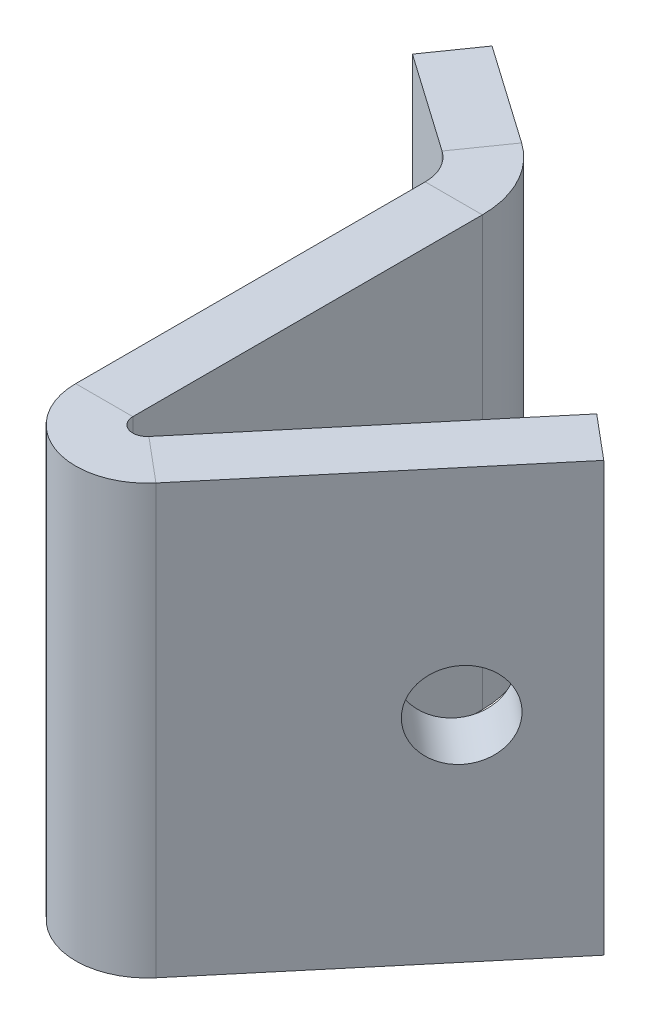
ISO-10303-21;
HEADER;
FILE_DESCRIPTION(('STEP AP214'),'2;1');
FILE_NAME('part.step','',(''),(''),'','','');
FILE_SCHEMA(('AUTOMOTIVE_DESIGN { 1 0 10303 214 1 1 1 1 }'));
ENDSEC;
DATA;
#1=APPLICATION_CONTEXT('core data for automotive mechanical design processes');
#2=APPLICATION_PROTOCOL_DEFINITION('international standard','automotive_design',2000,#1);
#3=PRODUCT_CONTEXT('',#1,'mechanical');
#4=PRODUCT('Part','Part','',(#3));
#5=PRODUCT_RELATED_PRODUCT_CATEGORY('part','',(#4));
#6=PRODUCT_DEFINITION_FORMATION('','',#4);
#7=PRODUCT_DEFINITION_CONTEXT('part definition',#1,'design');
#8=PRODUCT_DEFINITION('design','',#6,#7);
#9=PRODUCT_DEFINITION_SHAPE('','',#8);
#10=(LENGTH_UNIT() NAMED_UNIT(*) SI_UNIT(.MILLI.,.METRE.));
#11=(NAMED_UNIT(*) PLANE_ANGLE_UNIT() SI_UNIT($,.RADIAN.));
#12=(NAMED_UNIT(*) SI_UNIT($,.STERADIAN.) SOLID_ANGLE_UNIT());
#13=UNCERTAINTY_MEASURE_WITH_UNIT(LENGTH_MEASURE(1.E-05),#10,'distance_accuracy_value','');
#14=(GEOMETRIC_REPRESENTATION_CONTEXT(3) GLOBAL_UNCERTAINTY_ASSIGNED_CONTEXT((#13)) GLOBAL_UNIT_ASSIGNED_CONTEXT((#10,
#11,#12)) REPRESENTATION_CONTEXT('',''));
#15=CARTESIAN_POINT('',(0.,0.,0.));
#16=DIRECTION('',(0.,0.,1.));
#17=DIRECTION('',(1.,0.,0.));
#18=AXIS2_PLACEMENT_3D('',#15,#16,#17);
#19=CARTESIAN_POINT('',(2.09668481034567,10.5,-14.6276896660342));
#20=DIRECTION('',(0.,1.,0.));
#21=DIRECTION('',(0.,0.,-1.));
#22=AXIS2_PLACEMENT_3D('',#19,#20,#21);
#23=PLANE('',#22);
#24=DIRECTION('',(0.,0.,1.));
#25=VECTOR('',#24,1.);
#26=CARTESIAN_POINT('',(0.896684810345671,10.5,-14.6276896660342));
#27=LINE('',#26,#25);
#28=CARTESIAN_POINT('',(0.896684810345671,10.5,-17.3188014841031));
#29=VERTEX_POINT('',#28);
#30=CARTESIAN_POINT('',(0.896684810345671,10.5,-24.6591793205376));
#31=VERTEX_POINT('',#30);
#32=EDGE_CURVE('E66',#29,#31,#27,.F.);
#33=ORIENTED_EDGE('',*,*,#32,.T.);
#34=DIRECTION('',(1.,0.,0.));
#35=VECTOR('',#34,1.);
#36=CARTESIAN_POINT('',(0.896684810345669,10.5,-24.6591793205376));
#37=LINE('',#36,#35);
#38=CARTESIAN_POINT('',(2.09668481034567,10.5,-24.6591793205376));
#39=VERTEX_POINT('',#38);
#40=EDGE_CURVE('E208',#31,#39,#37,.T.);
#41=ORIENTED_EDGE('',*,*,#40,.T.);
#42=DIRECTION('',(0.,0.,-1.));
#43=VECTOR('',#42,1.);
#44=CARTESIAN_POINT('',(2.09668481034567,10.5,-14.6276896660342));
#45=LINE('',#44,#43);
#46=CARTESIAN_POINT('',(2.09668481034567,10.5,-17.3188014841031));
#47=VERTEX_POINT('',#46);
#48=EDGE_CURVE('E72',#47,#39,#45,.T.);
#49=ORIENTED_EDGE('',*,*,#48,.F.);
#50=DIRECTION('',(-1.,0.,0.));
#51=VECTOR('',#50,1.);
#52=CARTESIAN_POINT('',(2.09668481034567,10.5,-17.3188014841031));
#53=LINE('',#52,#51);
#54=EDGE_CURVE('E278',#47,#29,#53,.T.);
#55=ORIENTED_EDGE('',*,*,#54,.T.);
#56=EDGE_LOOP('',(#33,#41,#49,#55));
#57=FACE_BOUND('',#56,.T.);
#58=ADVANCED_FACE('F63',(#57),#23,.F.);
#59=CARTESIAN_POINT('',(2.09668481034567,10.5,-14.6276896660342));
#60=DIRECTION('',(-1.,0.,0.));
#61=DIRECTION('',(0.,0.,1.));
#62=AXIS2_PLACEMENT_3D('',#59,#60,#61);
#63=PLANE('',#62);
#64=DIRECTION('',(0.,-1.,0.));
#65=VECTOR('',#64,1.);
#66=CARTESIAN_POINT('',(2.09668481034567,10.5,-24.6591793205376));
#67=LINE('',#66,#65);
#68=CARTESIAN_POINT('',(2.09668481034567,19.5,-24.6591793205376));
#69=VERTEX_POINT('',#68);
#70=EDGE_CURVE('E199',#39,#69,#67,.F.);
#71=ORIENTED_EDGE('',*,*,#70,.T.);
#72=DIRECTION('',(0.,0.,1.));
#73=VECTOR('',#72,1.);
#74=CARTESIAN_POINT('',(2.09668481034567,19.5,-14.6276896660342));
#75=LINE('',#74,#73);
#76=CARTESIAN_POINT('',(2.09668481034567,19.5,-17.3188014841031));
#77=VERTEX_POINT('',#76);
#78=EDGE_CURVE('E13',#69,#77,#75,.T.);
#79=ORIENTED_EDGE('',*,*,#78,.T.);
#80=DIRECTION('',(0.,-1.,0.));
#81=VECTOR('',#80,1.);
#82=CARTESIAN_POINT('',(2.09668481034567,10.5,-17.3188014841031));
#83=LINE('',#82,#81);
#84=EDGE_CURVE('E286',#47,#77,#83,.F.);
#85=ORIENTED_EDGE('',*,*,#84,.F.);
#86=ORIENTED_EDGE('',*,*,#48,.T.);
#87=EDGE_LOOP('',(#71,#79,#85,#86));
#88=FACE_BOUND('',#87,.T.);
#89=ADVANCED_FACE('F360',(#88),#63,.F.);
#90=CARTESIAN_POINT('',(0.896684810345671,10.5,-14.6276896660342));
#91=DIRECTION('',(-1.,0.,0.));
#92=DIRECTION('',(0.,0.,1.));
#93=AXIS2_PLACEMENT_3D('',#90,#91,#92);
#94=PLANE('',#93);
#95=DIRECTION('',(0.,0.,1.));
#96=VECTOR('',#95,1.);
#97=CARTESIAN_POINT('',(0.896684810345671,19.5,-14.6276896660342));
#98=LINE('',#97,#96);
#99=CARTESIAN_POINT('',(0.896684810345671,19.5,-24.6591793205376));
#100=VERTEX_POINT('',#99);
#101=CARTESIAN_POINT('',(0.896684810345671,19.5,-17.3188014841031));
#102=VERTEX_POINT('',#101);
#103=EDGE_CURVE('E301',#100,#102,#98,.T.);
#104=ORIENTED_EDGE('',*,*,#103,.F.);
#105=DIRECTION('',(0.,-1.,0.));
#106=VECTOR('',#105,1.);
#107=CARTESIAN_POINT('',(0.896684810345669,10.5,-24.6591793205376));
#108=LINE('',#107,#106);
#109=EDGE_CURVE('E80',#31,#100,#108,.F.);
#110=ORIENTED_EDGE('',*,*,#109,.F.);
#111=ORIENTED_EDGE('',*,*,#32,.F.);
#112=DIRECTION('',(0.,-1.,0.));
#113=VECTOR('',#112,1.);
#114=CARTESIAN_POINT('',(0.896684810345671,10.5,-17.3188014841031));
#115=LINE('',#114,#113);
#116=EDGE_CURVE('E269',#29,#102,#115,.F.);
#117=ORIENTED_EDGE('',*,*,#116,.T.);
#118=EDGE_LOOP('',(#104,#110,#111,#117));
#119=FACE_BOUND('',#118,.T.);
#120=ADVANCED_FACE('F364',(#119),#94,.T.);
#121=CARTESIAN_POINT('',(2.09668481034567,19.5,-14.6276896660342));
#122=DIRECTION('',(0.,-1.,0.));
#123=DIRECTION('',(0.,0.,1.));
#124=AXIS2_PLACEMENT_3D('',#121,#122,#123);
#125=PLANE('',#124);
#126=DIRECTION('',(1.,0.,0.));
#127=VECTOR('',#126,1.);
#128=CARTESIAN_POINT('',(0.896684810345668,19.5,-24.6591793205376));
#129=LINE('',#128,#127);
#130=EDGE_CURVE('E88',#100,#69,#129,.T.);
#131=ORIENTED_EDGE('',*,*,#130,.F.);
#132=ORIENTED_EDGE('',*,*,#103,.T.);
#133=DIRECTION('',(-1.,0.,0.));
#134=VECTOR('',#133,1.);
#135=CARTESIAN_POINT('',(2.09668481034567,19.5,-17.3188014841031));
#136=LINE('',#135,#134);
#137=EDGE_CURVE('E293',#77,#102,#136,.T.);
#138=ORIENTED_EDGE('',*,*,#137,.F.);
#139=ORIENTED_EDGE('',*,*,#78,.F.);
#140=EDGE_LOOP('',(#131,#132,#138,#139));
#141=FACE_BOUND('',#140,.T.);
#142=ADVANCED_FACE('F370',(#141),#125,.F.);
#143=CARTESIAN_POINT('',(2.39668481034567,19.5,-17.3188014841031));
#144=DIRECTION('',(0.,1.,0.));
#145=DIRECTION('',(-1.,0.,0.));
#146=AXIS2_PLACEMENT_3D('',#143,#144,#145);
#147=PLANE('',#146);
#148=DIRECTION('',(-0.766044443118977,0.,-0.64278760968654));
#149=VECTOR('',#148,1.);
#150=CARTESIAN_POINT('',(3.54575147502413,19.5,-16.3546200695733));
#151=LINE('',#150,#149);
#152=CARTESIAN_POINT('',(2.62649814328136,19.5,-17.1259652011971));
#153=VERTEX_POINT('',#152);
#154=CARTESIAN_POINT('',(3.54575147502413,19.5,-16.3546200695733));
#155=VERTEX_POINT('',#154);
#156=EDGE_CURVE('E223',#153,#155,#151,.F.);
#157=ORIENTED_EDGE('',*,*,#156,.F.);
#158=CARTESIAN_POINT('',(2.39668481034567,19.5,-17.3188014841031));
#159=DIRECTION('',(0.,-1.,0.));
#160=DIRECTION('',(1.,0.,0.));
#161=AXIS2_PLACEMENT_3D('',#158,#159,#160);
#162=CIRCLE('',#161,0.299999999999998);
#163=EDGE_CURVE('E282',#77,#153,#162,.F.);
#164=ORIENTED_EDGE('',*,*,#163,.F.);
#165=ORIENTED_EDGE('',*,*,#137,.T.);
#166=CARTESIAN_POINT('',(2.39668481034567,19.5,-17.3188014841031));
#167=DIRECTION('',(0.,-1.,0.));
#168=DIRECTION('',(1.,0.,0.));
#169=AXIS2_PLACEMENT_3D('',#166,#167,#168);
#170=CIRCLE('',#169,1.5);
#171=EDGE_CURVE('E273',#102,#155,#170,.F.);
#172=ORIENTED_EDGE('',*,*,#171,.T.);
#173=EDGE_LOOP('',(#157,#164,#165,#172));
#174=FACE_BOUND('',#173,.T.);
#175=ADVANCED_FACE('F376',(#174),#147,.T.);
#176=CARTESIAN_POINT('',(2.39668481034567,10.5,-17.3188014841031));
#177=DIRECTION('',(0.,1.,0.));
#178=DIRECTION('',(-1.,0.,0.));
#179=AXIS2_PLACEMENT_3D('',#176,#177,#178);
#180=PLANE('',#179);
#181=CARTESIAN_POINT('',(2.39668481034567,10.5,-17.3188014841031));
#182=DIRECTION('',(0.,-1.,0.));
#183=DIRECTION('',(1.,0.,0.));
#184=AXIS2_PLACEMENT_3D('',#181,#182,#183);
#185=CIRCLE('',#184,0.299999999999998);
#186=CARTESIAN_POINT('',(2.62649814328136,10.5,-17.1259652011971));
#187=VERTEX_POINT('',#186);
#188=EDGE_CURVE('E231',#187,#47,#185,.T.);
#189=ORIENTED_EDGE('',*,*,#188,.F.);
#190=DIRECTION('',(-0.766044443118977,0.,-0.64278760968654));
#191=VECTOR('',#190,1.);
#192=CARTESIAN_POINT('',(2.62649814328136,10.5,-17.1259652011971));
#193=LINE('',#192,#191);
#194=CARTESIAN_POINT('',(3.54575147502413,10.5,-16.3546200695733));
#195=VERTEX_POINT('',#194);
#196=EDGE_CURVE('E259',#187,#195,#193,.F.);
#197=ORIENTED_EDGE('',*,*,#196,.T.);
#198=CARTESIAN_POINT('',(2.39668481034567,10.5,-17.3188014841031));
#199=DIRECTION('',(0.,-1.,0.));
#200=DIRECTION('',(1.,0.,0.));
#201=AXIS2_PLACEMENT_3D('',#198,#199,#200);
#202=CIRCLE('',#201,1.5);
#203=EDGE_CURVE('E274',#195,#29,#202,.T.);
#204=ORIENTED_EDGE('',*,*,#203,.T.);
#205=ORIENTED_EDGE('',*,*,#54,.F.);
#206=EDGE_LOOP('',(#189,#197,#204,#205));
#207=FACE_BOUND('',#206,.T.);
#208=ADVANCED_FACE('F373',(#207),#180,.F.);
#209=CARTESIAN_POINT('',(2.39668481034567,10.5,-17.3188014841031));
#210=DIRECTION('',(0.,-1.,0.));
#211=DIRECTION('',(0.766044443118977,0.,0.64278760968654));
#212=AXIS2_PLACEMENT_3D('',#209,#210,#211);
#213=CYLINDRICAL_SURFACE('',#212,1.5);
#214=ORIENTED_EDGE('',*,*,#116,.F.);
#215=ORIENTED_EDGE('',*,*,#203,.F.);
#216=DIRECTION('',(0.,-1.,0.));
#217=VECTOR('',#216,1.);
#218=CARTESIAN_POINT('',(3.54575147502413,19.5,-16.3546200695733));
#219=LINE('',#218,#217);
#220=EDGE_CURVE('E256',#195,#155,#219,.F.);
#221=ORIENTED_EDGE('',*,*,#220,.T.);
#222=ORIENTED_EDGE('',*,*,#171,.F.);
#223=EDGE_LOOP('',(#214,#215,#221,#222));
#224=FACE_BOUND('',#223,.T.);
#225=ADVANCED_FACE('F384',(#224),#213,.T.);
#226=CARTESIAN_POINT('',(2.39668481034567,10.5,-17.3188014841031));
#227=DIRECTION('',(0.,-1.,0.));
#228=DIRECTION('',(0.766044443118977,0.,0.64278760968654));
#229=AXIS2_PLACEMENT_3D('',#226,#227,#228);
#230=CYLINDRICAL_SURFACE('',#229,0.299999999999998);
#231=ORIENTED_EDGE('',*,*,#84,.T.);
#232=ORIENTED_EDGE('',*,*,#163,.T.);
#233=DIRECTION('',(0.,-1.,0.));
#234=VECTOR('',#233,1.);
#235=CARTESIAN_POINT('',(2.62649814328136,19.5,-17.1259652011971));
#236=LINE('',#235,#234);
#237=EDGE_CURVE('E263',#153,#187,#236,.T.);
#238=ORIENTED_EDGE('',*,*,#237,.T.);
#239=ORIENTED_EDGE('',*,*,#188,.T.);
#240=EDGE_LOOP('',(#231,#232,#238,#239));
#241=FACE_BOUND('',#240,.T.);
#242=ADVANCED_FACE('F387',(#241),#230,.F.);
#243=CARTESIAN_POINT('',(3.01593814208844,19.5,-15.7232131266429));
#244=DIRECTION('',(0.,-1.,0.));
#245=DIRECTION('',(0.,0.,-1.));
#246=AXIS2_PLACEMENT_3D('',#243,#244,#245);
#247=PLANE('',#246);
#248=ORIENTED_EDGE('',*,*,#156,.T.);
#249=DIRECTION('',(-0.64278760968654,0.,0.766044443118977));
#250=VECTOR('',#249,1.);
#251=CARTESIAN_POINT('',(2.89198536873848,19.5,-15.575491963691));
#252=LINE('',#251,#250);
#253=CARTESIAN_POINT('',(7.8368452147375,19.5,-21.4685464500352));
#254=VERTEX_POINT('',#253);
#255=EDGE_CURVE('E242',#254,#155,#252,.T.);
#256=ORIENTED_EDGE('',*,*,#255,.F.);
#257=DIRECTION('',(-0.766044443118977,0.,-0.64278760968654));
#258=VECTOR('',#257,1.);
#259=CARTESIAN_POINT('',(7.8368452147375,19.5,-21.4685464500352));
#260=LINE('',#259,#258);
#261=CARTESIAN_POINT('',(6.91759188299473,19.5,-22.239891581659));
#262=VERTEX_POINT('',#261);
#263=EDGE_CURVE('E232',#254,#262,#260,.T.);
#264=ORIENTED_EDGE('',*,*,#263,.T.);
#265=DIRECTION('',(0.64278760968654,0.,-0.766044443118977));
#266=VECTOR('',#265,1.);
#267=CARTESIAN_POINT('',(2.09668481034567,19.5,-16.4945582582667));
#268=LINE('',#267,#266);
#269=EDGE_CURVE('E252',#262,#153,#268,.F.);
#270=ORIENTED_EDGE('',*,*,#269,.T.);
#271=EDGE_LOOP('',(#248,#256,#264,#270));
#272=FACE_BOUND('',#271,.T.);
#273=ADVANCED_FACE('F390',(#272),#247,.F.);
#274=CARTESIAN_POINT('',(7.8368452147375,10.5,-21.4685464500352));
#275=DIRECTION('',(0.,1.,0.));
#276=DIRECTION('',(0.,0.,1.));
#277=AXIS2_PLACEMENT_3D('',#274,#275,#276);
#278=PLANE('',#277);
#279=ORIENTED_EDGE('',*,*,#196,.F.);
#280=DIRECTION('',(-0.64278760968654,0.,0.766044443118977));
#281=VECTOR('',#280,1.);
#282=CARTESIAN_POINT('',(6.91759188299472,10.5,-22.239891581659));
#283=LINE('',#282,#281);
#284=CARTESIAN_POINT('',(6.91759188299472,10.5,-22.239891581659));
#285=VERTEX_POINT('',#284);
#286=EDGE_CURVE('E249',#187,#285,#283,.F.);
#287=ORIENTED_EDGE('',*,*,#286,.T.);
#288=DIRECTION('',(-0.766044443118977,0.,-0.64278760968654));
#289=VECTOR('',#288,1.);
#290=CARTESIAN_POINT('',(7.8368452147375,10.5,-21.4685464500352));
#291=LINE('',#290,#289);
#292=CARTESIAN_POINT('',(7.8368452147375,10.5,-21.4685464500352));
#293=VERTEX_POINT('',#292);
#294=EDGE_CURVE('E227',#293,#285,#291,.T.);
#295=ORIENTED_EDGE('',*,*,#294,.F.);
#296=DIRECTION('',(0.64278760968654,0.,-0.766044443118977));
#297=VECTOR('',#296,1.);
#298=CARTESIAN_POINT('',(2.89198536873848,10.5,-15.575491963691));
#299=LINE('',#298,#297);
#300=EDGE_CURVE('E239',#195,#293,#299,.T.);
#301=ORIENTED_EDGE('',*,*,#300,.F.);
#302=EDGE_LOOP('',(#279,#287,#295,#301));
#303=FACE_BOUND('',#302,.T.);
#304=ADVANCED_FACE('F397',(#303),#278,.F.);
#305=CARTESIAN_POINT('',(2.89198536873848,10.5,-15.575491963691));
#306=DIRECTION('',(-0.766044443118977,0.,-0.64278760968654));
#307=DIRECTION('',(-0.64278760968654,0.,0.766044443118977));
#308=AXIS2_PLACEMENT_3D('',#305,#306,#307);
#309=PLANE('',#308);
#310=CARTESIAN_POINT('',(6.4756761411167,15.,-19.8463683164195));
#311=DIRECTION('',(-0.766044443118977,0.,-0.64278760968654));
#312=DIRECTION('',(-0.64278760968654,0.,0.766044443118977));
#313=AXIS2_PLACEMENT_3D('',#310,#311,#312);
#314=CIRCLE('',#313,0.900000000000001);
#315=CARTESIAN_POINT('',(5.89716729239881,15.,-19.1569283176124));
#316=VERTEX_POINT('',#315);
#317=EDGE_CURVE('E329',#316,#316,#314,.F.);
#318=ORIENTED_EDGE('',*,*,#317,.F.);
#319=EDGE_LOOP('',(#318));
#320=FACE_BOUND('',#319,.T.);
#321=ORIENTED_EDGE('',*,*,#220,.F.);
#322=ORIENTED_EDGE('',*,*,#300,.T.);
#323=DIRECTION('',(0.,1.,0.));
#324=VECTOR('',#323,1.);
#325=CARTESIAN_POINT('',(7.8368452147375,10.5,-21.4685464500352));
#326=LINE('',#325,#324);
#327=EDGE_CURVE('E236',#293,#254,#326,.T.);
#328=ORIENTED_EDGE('',*,*,#327,.T.);
#329=ORIENTED_EDGE('',*,*,#255,.T.);
#330=EDGE_LOOP('',(#321,#322,#328,#329));
#331=FACE_BOUND('',#330,.T.);
#332=ADVANCED_FACE('F401',(#320,#331),#309,.F.);
#333=CARTESIAN_POINT('',(1.97273203699571,10.5,-16.3468370953149));
#334=DIRECTION('',(-0.766044443118977,0.,-0.64278760968654));
#335=DIRECTION('',(-0.64278760968654,0.,0.766044443118977));
#336=AXIS2_PLACEMENT_3D('',#333,#334,#335);
#337=PLANE('',#336);
#338=CARTESIAN_POINT('',(5.55642280937393,15.,-20.6177134480433));
#339=DIRECTION('',(-0.766044443118977,0.,-0.64278760968654));
#340=DIRECTION('',(-0.64278760968654,0.,0.766044443118977));
#341=AXIS2_PLACEMENT_3D('',#338,#339,#340);
#342=CIRCLE('',#341,0.900000000000001);
#343=CARTESIAN_POINT('',(4.97791396065604,15.,-19.9282734492362));
#344=VERTEX_POINT('',#343);
#345=EDGE_CURVE('E644',#344,#344,#342,.T.);
#346=ORIENTED_EDGE('',*,*,#345,.F.);
#347=EDGE_LOOP('',(#346));
#348=FACE_BOUND('',#347,.T.);
#349=ORIENTED_EDGE('',*,*,#286,.F.);
#350=ORIENTED_EDGE('',*,*,#237,.F.);
#351=ORIENTED_EDGE('',*,*,#269,.F.);
#352=DIRECTION('',(0.,-1.,0.));
#353=VECTOR('',#352,1.);
#354=CARTESIAN_POINT('',(6.91759188299472,19.5,-22.239891581659));
#355=LINE('',#354,#353);
#356=EDGE_CURVE('E246',#285,#262,#355,.F.);
#357=ORIENTED_EDGE('',*,*,#356,.F.);
#358=EDGE_LOOP('',(#349,#350,#351,#357));
#359=FACE_BOUND('',#358,.T.);
#360=ADVANCED_FACE('F407',(#348,#359),#337,.T.);
#361=CARTESIAN_POINT('',(7.8368452147375,19.5,-21.4685464500352));
#362=DIRECTION('',(-0.64278760968654,0.,0.766044443118977));
#363=DIRECTION('',(0.766044443118977,0.,0.64278760968654));
#364=AXIS2_PLACEMENT_3D('',#361,#362,#363);
#365=PLANE('',#364);
#366=ORIENTED_EDGE('',*,*,#356,.T.);
#367=ORIENTED_EDGE('',*,*,#263,.F.);
#368=ORIENTED_EDGE('',*,*,#327,.F.);
#369=ORIENTED_EDGE('',*,*,#294,.T.);
#370=EDGE_LOOP('',(#366,#367,#368,#369));
#371=FACE_BOUND('',#370,.T.);
#372=ADVANCED_FACE('F403',(#371),#365,.F.);
#373=CARTESIAN_POINT('',(-0.00331518965433165,19.5,-24.6591793205376));
#374=DIRECTION('',(0.,1.,0.));
#375=DIRECTION('',(-1.,0.,0.));
#376=AXIS2_PLACEMENT_3D('',#373,#374,#375);
#377=PLANE('',#376);
#378=DIRECTION('',(0.57357643635105,0.,-0.819152044288989));
#379=VECTOR('',#378,1.);
#380=CARTESIAN_POINT('',(0.512903603061614,19.5,-25.3964161603977));
#381=LINE('',#380,#379);
#382=CARTESIAN_POINT('',(0.512903603061614,19.5,-25.3964161603977));
#383=VERTEX_POINT('',#382);
#384=CARTESIAN_POINT('',(1.20119532668287,19.5,-26.3793986135445));
#385=VERTEX_POINT('',#384);
#386=EDGE_CURVE('E323',#383,#385,#381,.T.);
#387=ORIENTED_EDGE('',*,*,#386,.F.);
#388=CARTESIAN_POINT('',(-0.00331518965433165,19.5,-24.6591793205376));
#389=DIRECTION('',(0.,-1.,0.));
#390=DIRECTION('',(1.,0.,0.));
#391=AXIS2_PLACEMENT_3D('',#388,#389,#390);
#392=CIRCLE('',#391,0.9);
#393=EDGE_CURVE('E212',#100,#383,#392,.F.);
#394=ORIENTED_EDGE('',*,*,#393,.F.);
#395=ORIENTED_EDGE('',*,*,#130,.T.);
#396=CARTESIAN_POINT('',(-0.00331518965433165,19.5,-24.6591793205376));
#397=DIRECTION('',(0.,-1.,0.));
#398=DIRECTION('',(1.,0.,0.));
#399=AXIS2_PLACEMENT_3D('',#396,#397,#398);
#400=CIRCLE('',#399,2.1);
#401=EDGE_CURVE('E203',#69,#385,#400,.F.);
#402=ORIENTED_EDGE('',*,*,#401,.T.);
#403=EDGE_LOOP('',(#387,#394,#395,#402));
#404=FACE_BOUND('',#403,.T.);
#405=ADVANCED_FACE('F406',(#404),#377,.T.);
#406=CARTESIAN_POINT('',(-0.00331518965433035,10.5,-24.6591793205376));
#407=DIRECTION('',(0.,1.,0.));
#408=DIRECTION('',(-1.,0.,0.));
#409=AXIS2_PLACEMENT_3D('',#406,#407,#408);
#410=PLANE('',#409);
#411=CARTESIAN_POINT('',(-0.00331518965433035,10.5,-24.6591793205376));
#412=DIRECTION('',(0.,-1.,0.));
#413=DIRECTION('',(1.,0.,0.));
#414=AXIS2_PLACEMENT_3D('',#411,#412,#413);
#415=CIRCLE('',#414,0.9);
#416=CARTESIAN_POINT('',(0.512903603061615,10.5,-25.3964161603977));
#417=VERTEX_POINT('',#416);
#418=EDGE_CURVE('E175',#417,#31,#415,.T.);
#419=ORIENTED_EDGE('',*,*,#418,.F.);
#420=DIRECTION('',(0.57357643635105,0.,-0.819152044288989));
#421=VECTOR('',#420,1.);
#422=CARTESIAN_POINT('',(0.512903603061614,10.5,-25.3964161603977));
#423=LINE('',#422,#421);
#424=CARTESIAN_POINT('',(1.20119532668288,10.5,-26.3793986135445));
#425=VERTEX_POINT('',#424);
#426=EDGE_CURVE('E322',#417,#425,#423,.T.);
#427=ORIENTED_EDGE('',*,*,#426,.T.);
#428=CARTESIAN_POINT('',(-0.00331518965433035,10.5,-24.6591793205376));
#429=DIRECTION('',(0.,-1.,0.));
#430=DIRECTION('',(1.,0.,0.));
#431=AXIS2_PLACEMENT_3D('',#428,#429,#430);
#432=CIRCLE('',#431,2.1);
#433=EDGE_CURVE('E204',#425,#39,#432,.T.);
#434=ORIENTED_EDGE('',*,*,#433,.T.);
#435=ORIENTED_EDGE('',*,*,#40,.F.);
#436=EDGE_LOOP('',(#419,#427,#434,#435));
#437=FACE_BOUND('',#436,.T.);
#438=ADVANCED_FACE('F312',(#437),#410,.F.);
#439=CARTESIAN_POINT('',(-0.00331518965433035,10.5,-24.6591793205376));
#440=DIRECTION('',(0.,-1.,0.));
#441=DIRECTION('',(0.57357643635105,0.,-0.819152044288989));
#442=AXIS2_PLACEMENT_3D('',#439,#440,#441);
#443=CYLINDRICAL_SURFACE('',#442,2.1);
#444=ORIENTED_EDGE('',*,*,#70,.F.);
#445=ORIENTED_EDGE('',*,*,#433,.F.);
#446=DIRECTION('',(0.,1.,0.));
#447=VECTOR('',#446,1.);
#448=CARTESIAN_POINT('',(1.20119532668288,10.5,-26.3793986135445));
#449=LINE('',#448,#447);
#450=EDGE_CURVE('E161',#425,#385,#449,.T.);
#451=ORIENTED_EDGE('',*,*,#450,.T.);
#452=ORIENTED_EDGE('',*,*,#401,.F.);
#453=EDGE_LOOP('',(#444,#445,#451,#452));
#454=FACE_BOUND('',#453,.T.);
#455=ADVANCED_FACE('F417',(#454),#443,.T.);
#456=CARTESIAN_POINT('',(-0.00331518965433035,10.5,-24.6591793205376));
#457=DIRECTION('',(0.,-1.,0.));
#458=DIRECTION('',(0.57357643635105,0.,-0.819152044288989));
#459=AXIS2_PLACEMENT_3D('',#456,#457,#458);
#460=CYLINDRICAL_SURFACE('',#459,0.9);
#461=ORIENTED_EDGE('',*,*,#109,.T.);
#462=ORIENTED_EDGE('',*,*,#393,.T.);
#463=DIRECTION('',(0.,-1.,0.));
#464=VECTOR('',#463,1.);
#465=CARTESIAN_POINT('',(0.512903603061614,19.5,-25.3964161603977));
#466=LINE('',#465,#464);
#467=EDGE_CURVE('E318',#383,#417,#466,.T.);
#468=ORIENTED_EDGE('',*,*,#467,.T.);
#469=ORIENTED_EDGE('',*,*,#418,.T.);
#470=EDGE_LOOP('',(#461,#462,#468,#469));
#471=FACE_BOUND('',#470,.T.);
#472=ADVANCED_FACE('F315',(#471),#460,.F.);
#473=CARTESIAN_POINT('',(7.12227185758952,10.5,-22.2334161922871));
#474=DIRECTION('',(-0.57357643635105,0.,0.819152044288989));
#475=DIRECTION('',(0.819152044288989,0.,0.57357643635105));
#476=AXIS2_PLACEMENT_3D('',#473,#474,#475);
#477=PLANE('',#476);
#478=CARTESIAN_POINT('',(0.356248467533448,15.,-26.9710367737076));
#479=DIRECTION('',(0.57357643635105,0.,-0.819152044288989));
#480=DIRECTION('',(-0.819152044288989,0.,-0.57357643635105));
#481=AXIS2_PLACEMENT_3D('',#478,#479,#480);
#482=CIRCLE('',#481,0.9);
#483=CARTESIAN_POINT('',(-0.380988372326642,15.,-27.4872555664235));
#484=VERTEX_POINT('',#483);
#485=EDGE_CURVE('E191',#484,#484,#482,.T.);
#486=ORIENTED_EDGE('',*,*,#485,.F.);
#487=EDGE_LOOP('',(#486));
#488=FACE_BOUND('',#487,.T.);
#489=ORIENTED_EDGE('',*,*,#450,.F.);
#490=DIRECTION('',(-0.819152044288989,0.,-0.57357643635105));
#491=VECTOR('',#490,1.);
#492=CARTESIAN_POINT('',(-0.872479598900035,10.5,-27.8314014282342));
#493=LINE('',#492,#491);
#494=CARTESIAN_POINT('',(-0.872479598900035,10.5,-27.8314014282342));
#495=VERTEX_POINT('',#494);
#496=EDGE_CURVE('E154',#425,#495,#493,.T.);
#497=ORIENTED_EDGE('',*,*,#496,.T.);
#498=DIRECTION('',(0.,1.,0.));
#499=VECTOR('',#498,1.);
#500=CARTESIAN_POINT('',(-0.872479598900035,19.5,-27.8314014282342));
#501=LINE('',#500,#499);
#502=CARTESIAN_POINT('',(-0.872479598900035,19.5,-27.8314014282342));
#503=VERTEX_POINT('',#502);
#504=EDGE_CURVE('E159',#495,#503,#501,.T.);
#505=ORIENTED_EDGE('',*,*,#504,.T.);
#506=DIRECTION('',(0.819152044288989,0.,0.57357643635105));
#507=VECTOR('',#506,1.);
#508=CARTESIAN_POINT('',(1.58497653396693,19.5,-26.110672119181));
#509=LINE('',#508,#507);
#510=EDGE_CURVE('E182',#503,#385,#509,.T.);
#511=ORIENTED_EDGE('',*,*,#510,.T.);
#512=EDGE_LOOP('',(#489,#497,#505,#511));
#513=FACE_BOUND('',#512,.T.);
#514=ADVANCED_FACE('F156',(#488,#513),#477,.F.);
#515=CARTESIAN_POINT('',(6.43398013396826,10.5,-21.2504337391403));
#516=DIRECTION('',(-0.57357643635105,0.,0.819152044288989));
#517=DIRECTION('',(0.819152044288989,0.,0.57357643635105));
#518=AXIS2_PLACEMENT_3D('',#515,#516,#517);
#519=PLANE('',#518);
#520=CARTESIAN_POINT('',(-0.332043256087812,15.,-25.9880543205608));
#521=DIRECTION('',(0.57357643635105,0.,-0.819152044288989));
#522=DIRECTION('',(-0.819152044288989,0.,-0.57357643635105));
#523=AXIS2_PLACEMENT_3D('',#520,#521,#522);
#524=CIRCLE('',#523,0.9);
#525=CARTESIAN_POINT('',(-1.0692800959479,15.,-26.5042731132767));
#526=VERTEX_POINT('',#525);
#527=EDGE_CURVE('E336',#526,#526,#524,.T.);
#528=ORIENTED_EDGE('',*,*,#527,.T.);
#529=EDGE_LOOP('',(#528));
#530=FACE_BOUND('',#529,.T.);
#531=DIRECTION('',(-0.819152044288989,0.,-0.57357643635105));
#532=VECTOR('',#531,1.);
#533=CARTESIAN_POINT('',(-1.5607713225213,10.5,-26.8484189750874));
#534=LINE('',#533,#532);
#535=CARTESIAN_POINT('',(-1.5607713225213,10.5,-26.8484189750874));
#536=VERTEX_POINT('',#535);
#537=EDGE_CURVE('E171',#417,#536,#534,.T.);
#538=ORIENTED_EDGE('',*,*,#537,.F.);
#539=ORIENTED_EDGE('',*,*,#467,.F.);
#540=DIRECTION('',(0.819152044288989,0.,0.57357643635105));
#541=VECTOR('',#540,1.);
#542=CARTESIAN_POINT('',(0.896684810345671,19.5,-25.1276896660342));
#543=LINE('',#542,#541);
#544=CARTESIAN_POINT('',(-1.5607713225213,19.5,-26.8484189750874));
#545=VERTEX_POINT('',#544);
#546=EDGE_CURVE('E165',#545,#383,#543,.T.);
#547=ORIENTED_EDGE('',*,*,#546,.F.);
#548=DIRECTION('',(0.,1.,0.));
#549=VECTOR('',#548,1.);
#550=CARTESIAN_POINT('',(-1.5607713225213,19.5,-26.8484189750874));
#551=LINE('',#550,#549);
#552=EDGE_CURVE('E190',#536,#545,#551,.T.);
#553=ORIENTED_EDGE('',*,*,#552,.F.);
#554=EDGE_LOOP('',(#538,#539,#547,#553));
#555=FACE_BOUND('',#554,.T.);
#556=ADVANCED_FACE('F343',(#530,#555),#519,.T.);
#557=CARTESIAN_POINT('',(-0.872479598900035,10.5,-27.8314014282342));
#558=DIRECTION('',(0.,1.,0.));
#559=DIRECTION('',(-1.,0.,0.));
#560=AXIS2_PLACEMENT_3D('',#557,#558,#559);
#561=PLANE('',#560);
#562=ORIENTED_EDGE('',*,*,#426,.F.);
#563=ORIENTED_EDGE('',*,*,#537,.T.);
#564=DIRECTION('',(-0.57357643635105,0.,0.819152044288989));
#565=VECTOR('',#564,1.);
#566=CARTESIAN_POINT('',(-0.872479598900035,10.5,-27.8314014282342));
#567=LINE('',#566,#565);
#568=EDGE_CURVE('E168',#495,#536,#567,.T.);
#569=ORIENTED_EDGE('',*,*,#568,.F.);
#570=ORIENTED_EDGE('',*,*,#496,.F.);
#571=EDGE_LOOP('',(#562,#563,#569,#570));
#572=FACE_BOUND('',#571,.T.);
#573=ADVANCED_FACE('F169',(#572),#561,.F.);
#574=CARTESIAN_POINT('',(1.58497653396693,19.5,-26.110672119181));
#575=DIRECTION('',(0.,-1.,0.));
#576=DIRECTION('',(0.,0.,-1.));
#577=AXIS2_PLACEMENT_3D('',#574,#575,#576);
#578=PLANE('',#577);
#579=ORIENTED_EDGE('',*,*,#386,.T.);
#580=ORIENTED_EDGE('',*,*,#510,.F.);
#581=DIRECTION('',(-0.57357643635105,0.,0.819152044288989));
#582=VECTOR('',#581,1.);
#583=CARTESIAN_POINT('',(-0.872479598900035,19.5,-27.8314014282342));
#584=LINE('',#583,#582);
#585=EDGE_CURVE('E176',#503,#545,#584,.T.);
#586=ORIENTED_EDGE('',*,*,#585,.T.);
#587=ORIENTED_EDGE('',*,*,#546,.T.);
#588=EDGE_LOOP('',(#579,#580,#586,#587));
#589=FACE_BOUND('',#588,.T.);
#590=ADVANCED_FACE('F356',(#589),#578,.F.);
#591=CARTESIAN_POINT('',(-0.872479598900035,19.5,-27.8314014282342));
#592=DIRECTION('',(0.819152044288989,0.,0.57357643635105));
#593=DIRECTION('',(0.57357643635105,0.,-0.819152044288989));
#594=AXIS2_PLACEMENT_3D('',#591,#592,#593);
#595=PLANE('',#594);
#596=ORIENTED_EDGE('',*,*,#552,.T.);
#597=ORIENTED_EDGE('',*,*,#585,.F.);
#598=ORIENTED_EDGE('',*,*,#504,.F.);
#599=ORIENTED_EDGE('',*,*,#568,.T.);
#600=EDGE_LOOP('',(#596,#597,#598,#599));
#601=FACE_BOUND('',#600,.T.);
#602=ADVANCED_FACE('F178',(#601),#595,.F.);
#603=CARTESIAN_POINT('',(0.356248467533448,15.,-26.9710367737076));
#604=DIRECTION('',(-0.57357643635105,0.,0.819152044288989));
#605=DIRECTION('',(0.819152044288989,0.,0.57357643635105));
#606=AXIS2_PLACEMENT_3D('',#603,#604,#605);
#607=CYLINDRICAL_SURFACE('',#606,0.9);
#608=ORIENTED_EDGE('',*,*,#485,.T.);
#609=EDGE_LOOP('',(#608));
#610=FACE_BOUND('',#609,.T.);
#611=ORIENTED_EDGE('',*,*,#527,.F.);
#612=EDGE_LOOP('',(#611));
#613=FACE_BOUND('',#612,.T.);
#614=ADVANCED_FACE('F345',(#610,#613),#607,.F.);
#615=CARTESIAN_POINT('',(9.25795623200212,15.,-17.5117581183256));
#616=DIRECTION('',(-0.766044443118977,0.,-0.64278760968654));
#617=DIRECTION('',(-0.64278760968654,0.,0.766044443118977));
#618=AXIS2_PLACEMENT_3D('',#615,#616,#617);
#619=CYLINDRICAL_SURFACE('',#618,0.900000000000001);
#620=CARTESIAN_POINT('',(4.97791396065604,15.,-19.9282734492362));
#621=CARTESIAN_POINT('',(4.98748951619503,15.,-19.9202386041152));
#622=CARTESIAN_POINT('',(4.99706507173402,15.,-19.9122037589941));
#623=CARTESIAN_POINT('',(5.01621618281199,15.,-19.8961340687519));
#624=CARTESIAN_POINT('',(5.02579173835098,15.,-19.8880992236308));
#625=CARTESIAN_POINT('',(5.04494284942895,15.,-19.8720295333887));
#626=CARTESIAN_POINT('',(5.05451840496794,15.,-19.8639946882676));
#627=CARTESIAN_POINT('',(5.07366951604592,15.,-19.8479249980254));
#628=CARTESIAN_POINT('',(5.0832450715849,15.,-19.8398901529043));
#629=CARTESIAN_POINT('',(5.10239618266288,15.,-19.8238204626622));
#630=CARTESIAN_POINT('',(5.11197173820186,15.,-19.8157856175411));
#631=CARTESIAN_POINT('',(5.13112284927984,15.,-19.7997159272989));
#632=CARTESIAN_POINT('',(5.14069840481883,15.,-19.7916810821779));
#633=CARTESIAN_POINT('',(5.1598495158968,15.,-19.7756113919357));
#634=CARTESIAN_POINT('',(5.16942507143579,15.,-19.7675765468146));
#635=CARTESIAN_POINT('',(5.18857618251376,15.,-19.7515068565724));
#636=CARTESIAN_POINT('',(5.19815173805275,15.,-19.7434720114514));
#637=CARTESIAN_POINT('',(5.21730284913072,15.,-19.7274023212092));
#638=CARTESIAN_POINT('',(5.22687840466971,15.,-19.7193674760881));
#639=CARTESIAN_POINT('',(5.24602951574768,15.,-19.703297785846));
#640=CARTESIAN_POINT('',(5.25560507128667,15.,-19.6952629407249));
#641=CARTESIAN_POINT('',(5.27475618236465,15.,-19.6791932504827));
#642=CARTESIAN_POINT('',(5.28433173790363,15.,-19.6711584053616));
#643=CARTESIAN_POINT('',(5.30348284898161,15.,-19.6550887151195));
#644=CARTESIAN_POINT('',(5.31305840452059,15.,-19.6470538699984));
#645=CARTESIAN_POINT('',(5.33220951559857,15.,-19.6309841797562));
#646=CARTESIAN_POINT('',(5.34178507113756,15.,-19.6229493346351));
#647=CARTESIAN_POINT('',(5.36093618221553,15.,-19.606879644393));
#648=CARTESIAN_POINT('',(5.37051173775452,15.,-19.5988447992719));
#649=CARTESIAN_POINT('',(5.38966284883249,15.,-19.5827751090297));
#650=CARTESIAN_POINT('',(5.39923840437148,15.,-19.5747402639086));
#651=CARTESIAN_POINT('',(5.41838951544946,15.,-19.5586705736665));
#652=CARTESIAN_POINT('',(5.42796507098844,15.,-19.5506357285454));
#653=CARTESIAN_POINT('',(5.44711618206642,15.,-19.5345660383032));
#654=CARTESIAN_POINT('',(5.4566917376054,15.,-19.5265311931822));
#655=CARTESIAN_POINT('',(5.47584284868338,15.,-19.51046150294));
#656=CARTESIAN_POINT('',(5.48541840422237,15.,-19.5024266578189));
#657=CARTESIAN_POINT('',(5.50456951530034,15.,-19.4863569675768));
#658=CARTESIAN_POINT('',(5.51414507083933,15.,-19.4783221224557));
#659=CARTESIAN_POINT('',(5.5332961819173,15.,-19.4622524322135));
#660=CARTESIAN_POINT('',(5.54287173745629,15.,-19.4542175870924));
#661=CARTESIAN_POINT('',(5.56202284853426,15.,-19.4381478968503));
#662=CARTESIAN_POINT('',(5.57159840407325,15.,-19.4301130517292));
#663=CARTESIAN_POINT('',(5.59074951515122,15.,-19.414043361487));
#664=CARTESIAN_POINT('',(5.60032507069021,15.,-19.4060085163659));
#665=CARTESIAN_POINT('',(5.61947618176819,15.,-19.3899388261238));
#666=CARTESIAN_POINT('',(5.62905173730717,15.,-19.3819039810027));
#667=CARTESIAN_POINT('',(5.64820284838515,15.,-19.3658342907605));
#668=CARTESIAN_POINT('',(5.65777840392413,15.,-19.3577994456394));
#669=CARTESIAN_POINT('',(5.67692951500211,15.,-19.3417297553973));
#670=CARTESIAN_POINT('',(5.6865050705411,15.,-19.3336949102762));
#671=CARTESIAN_POINT('',(5.70565618161907,15.,-19.317625220034));
#672=CARTESIAN_POINT('',(5.71523173715806,15.,-19.309590374913));
#673=CARTESIAN_POINT('',(5.73438284823603,15.,-19.2935206846708));
#674=CARTESIAN_POINT('',(5.74395840377502,15.,-19.2854858395497));
#675=CARTESIAN_POINT('',(5.76310951485299,15.,-19.2694161493075));
#676=CARTESIAN_POINT('',(5.77268507039198,15.,-19.2613813041865));
#677=CARTESIAN_POINT('',(5.79183618146996,15.,-19.2453116139443));
#678=CARTESIAN_POINT('',(5.80141173700894,15.,-19.2372767688232));
#679=CARTESIAN_POINT('',(5.82056284808692,15.,-19.2212070785811));
#680=CARTESIAN_POINT('',(5.8301384036259,15.,-19.21317223346));
#681=CARTESIAN_POINT('',(5.84928951470388,15.,-19.1971025432178));
#682=CARTESIAN_POINT('',(5.85886507024287,15.,-19.1890676980967));
#683=CARTESIAN_POINT('',(5.87801618132084,15.,-19.1729980078546));
#684=CARTESIAN_POINT('',(5.88759173685983,15.,-19.1649631627335));
#685=CARTESIAN_POINT('',(5.89716729239881,15.,-19.1569283176124));
#686=B_SPLINE_CURVE_WITH_KNOTS('',3,(#620,#621,#622,#623,#624,#625,#626,#627,#628,#629,#630,
#631,#632,#633,#634,#635,#636,#637,#638,#639,#640,#641,#642,#643,#644,#645,#646,#647,#648,#649,
#650,#651,#652,#653,#654,#655,#656,#657,#658,#659,#660,#661,#662,#663,#664,#665,#666,#667,#668,
#669,#670,#671,#672,#673,#674,#675,#676,#677,#678,#679,#680,#681,#682,#683,#684,#685),
.UNSPECIFIED.,.F.,.F.,(4,2,2,2,2,2,2,2,2,2,2,2,2,2,2,2,2,2,2,2,2,2,2,2,2,2,2,2,2,2,2,2,4),(0.,
0.0374999999999993,0.0750000000000001,0.112499999999999,0.149999999999999,0.1875,
0.224999999999999,0.2625,0.299999999999999,0.337499999999998,0.374999999999999,
0.412499999999999,0.45,0.487499999999998,0.525,0.562499999999999,0.6,0.637499999999999,
0.674999999999998,0.7125,0.749999999999998,0.7875,0.824999999999999,0.862499999999998,
0.899999999999999,0.937499999999998,0.975,1.0125,1.05,1.0875,1.125,1.1625,1.2),.UNSPECIFIED.);
#687=EDGE_CURVE('BSEAM347',#344,#316,#686,.T.);
#688=ORIENTED_EDGE('',*,*,#345,.T.);
#689=ORIENTED_EDGE('',*,*,#317,.T.);
#690=ORIENTED_EDGE('',*,*,#687,.T.);
#691=ORIENTED_EDGE('',*,*,#687,.F.);
#692=EDGE_LOOP('',(#688,#690,#689,#691));
#693=FACE_BOUND('',#692,.T.);
#694=ADVANCED_FACE('F347',(#693),#619,.F.);
#695=CLOSED_SHELL('',(#58,#89,#120,#142,#175,#208,#225,#242,#273,#304,#332,#360,#372,#405,#438,
#455,#472,#514,#556,#573,#590,#602,#614,#694));
#696=MANIFOLD_SOLID_BREP('B2',#695);
#697=ADVANCED_BREP_SHAPE_REPRESENTATION('',(#18,#696),#14);
#698=SHAPE_DEFINITION_REPRESENTATION(#9,#697);
ENDSEC;
END-ISO-10303-21;
